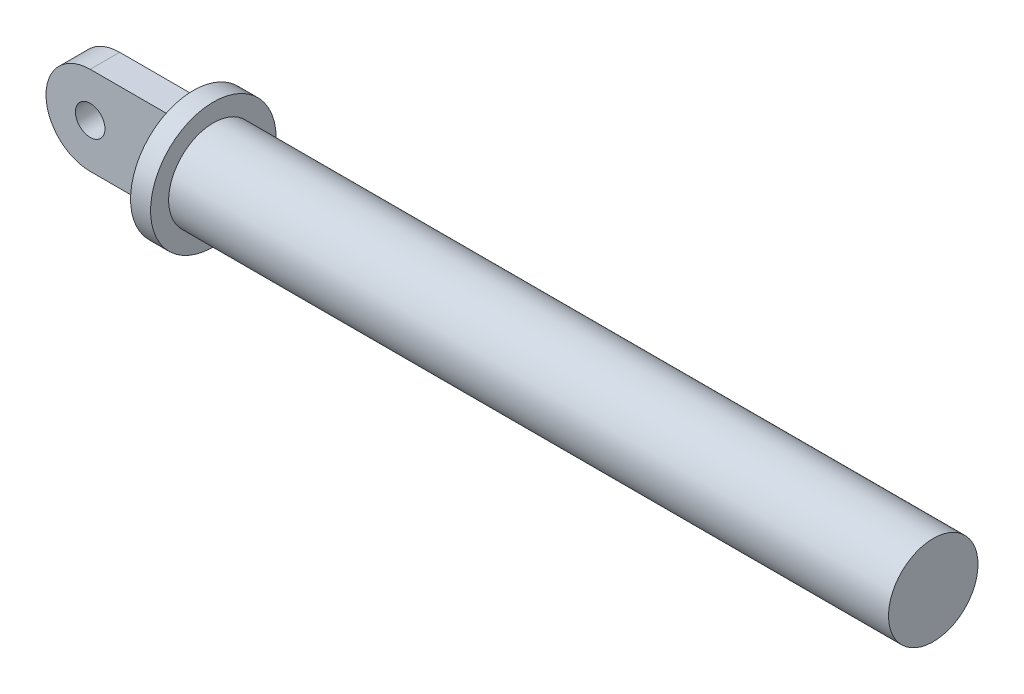
ISO-10303-21;
HEADER;
FILE_DESCRIPTION(('STEP AP214'),'2;1');
FILE_NAME('part.step','',(''),(''),'','','');
FILE_SCHEMA(('AUTOMOTIVE_DESIGN { 1 0 10303 214 1 1 1 1 }'));
ENDSEC;
DATA;
#1=APPLICATION_CONTEXT('core data for automotive mechanical design processes');
#2=APPLICATION_PROTOCOL_DEFINITION('international standard','automotive_design',2000,#1);
#3=PRODUCT_CONTEXT('',#1,'mechanical');
#4=PRODUCT('Part','Part','',(#3));
#5=PRODUCT_RELATED_PRODUCT_CATEGORY('part','',(#4));
#6=PRODUCT_DEFINITION_FORMATION('','',#4);
#7=PRODUCT_DEFINITION_CONTEXT('part definition',#1,'design');
#8=PRODUCT_DEFINITION('design','',#6,#7);
#9=PRODUCT_DEFINITION_SHAPE('','',#8);
#10=(LENGTH_UNIT() NAMED_UNIT(*) SI_UNIT(.MILLI.,.METRE.));
#11=(NAMED_UNIT(*) PLANE_ANGLE_UNIT() SI_UNIT($,.RADIAN.));
#12=(NAMED_UNIT(*) SI_UNIT($,.STERADIAN.) SOLID_ANGLE_UNIT());
#13=UNCERTAINTY_MEASURE_WITH_UNIT(LENGTH_MEASURE(1.E-05),#10,'distance_accuracy_value','');
#14=(GEOMETRIC_REPRESENTATION_CONTEXT(3) GLOBAL_UNCERTAINTY_ASSIGNED_CONTEXT((#13)) GLOBAL_UNIT_ASSIGNED_CONTEXT((#10,
#11,#12)) REPRESENTATION_CONTEXT('',''));
#15=CARTESIAN_POINT('',(0.,0.,0.));
#16=DIRECTION('',(0.,0.,1.));
#17=DIRECTION('',(1.,0.,0.));
#18=AXIS2_PLACEMENT_3D('',#15,#16,#17);
#19=CARTESIAN_POINT('',(-52.4189353722762,24.017679889152,5.));
#20=DIRECTION('',(0.,0.,1.));
#21=DIRECTION('',(1.,0.,0.));
#22=AXIS2_PLACEMENT_3D('',#19,#20,#21);
#23=PLANE('',#22);
#24=CARTESIAN_POINT('',(-52.4189353722762,24.017679889152,5.));
#25=DIRECTION('',(0.,0.,1.));
#26=DIRECTION('',(1.,0.,0.));
#27=AXIS2_PLACEMENT_3D('',#24,#25,#26);
#28=CIRCLE('',#27,15.);
#29=CARTESIAN_POINT('',(-52.4189353722762,39.017679889152,5.));
#30=VERTEX_POINT('',#29);
#31=CARTESIAN_POINT('',(-52.4189353722762,9.01767988915204,5.));
#32=VERTEX_POINT('',#31);
#33=EDGE_CURVE('E77',#30,#32,#28,.T.);
#34=ORIENTED_EDGE('',*,*,#33,.T.);
#35=DIRECTION('',(1.,0.,0.));
#36=VECTOR('',#35,1.);
#37=CARTESIAN_POINT('',(-52.4189353722762,9.01767988915204,5.));
#38=LINE('',#37,#36);
#39=CARTESIAN_POINT('',(-22.4189353722762,9.01767988915204,5.));
#40=VERTEX_POINT('',#39);
#41=EDGE_CURVE('E108',#32,#40,#38,.T.);
#42=ORIENTED_EDGE('',*,*,#41,.T.);
#43=DIRECTION('',(0.,1.,0.));
#44=VECTOR('',#43,1.);
#45=CARTESIAN_POINT('',(-22.4189353722762,39.017679889152,5.));
#46=LINE('',#45,#44);
#47=CARTESIAN_POINT('',(-22.4189353722762,39.017679889152,5.));
#48=VERTEX_POINT('',#47);
#49=EDGE_CURVE('E102',#40,#48,#46,.T.);
#50=ORIENTED_EDGE('',*,*,#49,.T.);
#51=DIRECTION('',(-1.,0.,0.));
#52=VECTOR('',#51,1.);
#53=CARTESIAN_POINT('',(-52.4189353722762,39.017679889152,5.));
#54=LINE('',#53,#52);
#55=EDGE_CURVE('E49',#48,#30,#54,.T.);
#56=ORIENTED_EDGE('',*,*,#55,.T.);
#57=EDGE_LOOP('',(#34,#42,#50,#56));
#58=FACE_BOUND('',#57,.T.);
#59=CARTESIAN_POINT('',(-52.4189353722762,24.017679889152,5.));
#60=DIRECTION('',(0.,0.,1.));
#61=DIRECTION('',(1.,0.,0.));
#62=AXIS2_PLACEMENT_3D('',#59,#60,#61);
#63=CIRCLE('',#62,5.00368331024003);
#64=CARTESIAN_POINT('',(-47.4152520620362,24.017679889152,5.));
#65=VERTEX_POINT('',#64);
#66=EDGE_CURVE('E88',#65,#65,#63,.T.);
#67=ORIENTED_EDGE('',*,*,#66,.F.);
#68=EDGE_LOOP('',(#67));
#69=FACE_BOUND('',#68,.T.);
#70=ADVANCED_FACE('F32',(#58,#69),#23,.T.);
#71=CARTESIAN_POINT('',(-52.4189353722762,24.017679889152,-5.));
#72=DIRECTION('',(0.,0.,1.));
#73=DIRECTION('',(1.,0.,0.));
#74=AXIS2_PLACEMENT_3D('',#71,#72,#73);
#75=PLANE('',#74);
#76=CARTESIAN_POINT('',(-52.4189353722762,24.017679889152,-5.));
#77=DIRECTION('',(0.,0.,1.));
#78=DIRECTION('',(1.,0.,0.));
#79=AXIS2_PLACEMENT_3D('',#76,#77,#78);
#80=CIRCLE('',#79,15.);
#81=CARTESIAN_POINT('',(-52.4189353722762,39.017679889152,-5.));
#82=VERTEX_POINT('',#81);
#83=CARTESIAN_POINT('',(-52.4189353722762,9.01767988915204,-5.));
#84=VERTEX_POINT('',#83);
#85=EDGE_CURVE('E82',#82,#84,#80,.T.);
#86=ORIENTED_EDGE('',*,*,#85,.F.);
#87=DIRECTION('',(-1.,0.,0.));
#88=VECTOR('',#87,1.);
#89=CARTESIAN_POINT('',(-52.4189353722762,39.017679889152,-5.));
#90=LINE('',#89,#88);
#91=CARTESIAN_POINT('',(-22.4189353722762,39.017679889152,-5.));
#92=VERTEX_POINT('',#91);
#93=EDGE_CURVE('E69',#92,#82,#90,.T.);
#94=ORIENTED_EDGE('',*,*,#93,.F.);
#95=DIRECTION('',(0.,1.,0.));
#96=VECTOR('',#95,1.);
#97=CARTESIAN_POINT('',(-22.4189353722762,39.017679889152,-5.));
#98=LINE('',#97,#96);
#99=CARTESIAN_POINT('',(-22.4189353722762,9.01767988915204,-5.));
#100=VERTEX_POINT('',#99);
#101=EDGE_CURVE('E64',#100,#92,#98,.T.);
#102=ORIENTED_EDGE('',*,*,#101,.F.);
#103=DIRECTION('',(1.,0.,0.));
#104=VECTOR('',#103,1.);
#105=CARTESIAN_POINT('',(-52.4189353722762,9.01767988915204,-5.));
#106=LINE('',#105,#104);
#107=EDGE_CURVE('E87',#84,#100,#106,.T.);
#108=ORIENTED_EDGE('',*,*,#107,.F.);
#109=EDGE_LOOP('',(#86,#94,#102,#108));
#110=FACE_BOUND('',#109,.T.);
#111=CARTESIAN_POINT('',(-52.4189353722762,24.017679889152,-5.));
#112=DIRECTION('',(0.,0.,1.));
#113=DIRECTION('',(1.,0.,0.));
#114=AXIS2_PLACEMENT_3D('',#111,#112,#113);
#115=CIRCLE('',#114,5.00368331024003);
#116=CARTESIAN_POINT('',(-47.4152520620362,24.017679889152,-5.));
#117=VERTEX_POINT('',#116);
#118=EDGE_CURVE('E92',#117,#117,#115,.T.);
#119=ORIENTED_EDGE('',*,*,#118,.T.);
#120=EDGE_LOOP('',(#119));
#121=FACE_BOUND('',#120,.T.);
#122=ADVANCED_FACE('F84',(#110,#121),#75,.F.);
#123=CARTESIAN_POINT('',(-52.4189353722762,24.017679889152,5.));
#124=DIRECTION('',(0.,0.,-1.));
#125=DIRECTION('',(-1.,0.,0.));
#126=AXIS2_PLACEMENT_3D('',#123,#124,#125);
#127=CYLINDRICAL_SURFACE('',#126,15.);
#128=ORIENTED_EDGE('',*,*,#85,.T.);
#129=DIRECTION('',(0.,0.,-1.));
#130=VECTOR('',#129,1.);
#131=CARTESIAN_POINT('',(-52.4189353722762,9.01767988915204,5.));
#132=LINE('',#131,#130);
#133=EDGE_CURVE('E11',#32,#84,#132,.T.);
#134=ORIENTED_EDGE('',*,*,#133,.F.);
#135=ORIENTED_EDGE('',*,*,#33,.F.);
#136=DIRECTION('',(0.,0.,-1.));
#137=VECTOR('',#136,1.);
#138=CARTESIAN_POINT('',(-52.4189353722762,39.017679889152,5.));
#139=LINE('',#138,#137);
#140=EDGE_CURVE('E72',#30,#82,#139,.T.);
#141=ORIENTED_EDGE('',*,*,#140,.T.);
#142=EDGE_LOOP('',(#128,#134,#135,#141));
#143=FACE_BOUND('',#142,.T.);
#144=ADVANCED_FACE('F34',(#143),#127,.T.);
#145=CARTESIAN_POINT('',(-52.4189353722762,9.01767988915204,5.));
#146=DIRECTION('',(0.,1.,0.));
#147=DIRECTION('',(0.,0.,1.));
#148=AXIS2_PLACEMENT_3D('',#145,#146,#147);
#149=PLANE('',#148);
#150=ORIENTED_EDGE('',*,*,#107,.T.);
#151=DIRECTION('',(0.,0.,-1.));
#152=VECTOR('',#151,1.);
#153=CARTESIAN_POINT('',(-22.4189353722762,9.01767988915204,5.));
#154=LINE('',#153,#152);
#155=EDGE_CURVE('E41',#40,#100,#154,.T.);
#156=ORIENTED_EDGE('',*,*,#155,.F.);
#157=ORIENTED_EDGE('',*,*,#41,.F.);
#158=ORIENTED_EDGE('',*,*,#133,.T.);
#159=EDGE_LOOP('',(#150,#156,#157,#158));
#160=FACE_BOUND('',#159,.T.);
#161=ADVANCED_FACE('F107',(#160),#149,.F.);
#162=CARTESIAN_POINT('',(-52.4189353722762,39.017679889152,5.));
#163=DIRECTION('',(0.,-1.,0.));
#164=DIRECTION('',(0.,0.,-1.));
#165=AXIS2_PLACEMENT_3D('',#162,#163,#164);
#166=PLANE('',#165);
#167=ORIENTED_EDGE('',*,*,#93,.T.);
#168=ORIENTED_EDGE('',*,*,#140,.F.);
#169=ORIENTED_EDGE('',*,*,#55,.F.);
#170=DIRECTION('',(0.,0.,-1.));
#171=VECTOR('',#170,1.);
#172=CARTESIAN_POINT('',(-22.4189353722762,39.017679889152,5.));
#173=LINE('',#172,#171);
#174=EDGE_CURVE('E74',#48,#92,#173,.T.);
#175=ORIENTED_EDGE('',*,*,#174,.T.);
#176=EDGE_LOOP('',(#167,#168,#169,#175));
#177=FACE_BOUND('',#176,.T.);
#178=ADVANCED_FACE('F71',(#177),#166,.F.);
#179=CARTESIAN_POINT('',(-52.4189353722762,24.017679889152,5.));
#180=DIRECTION('',(0.,0.,-1.));
#181=DIRECTION('',(-1.,0.,0.));
#182=AXIS2_PLACEMENT_3D('',#179,#180,#181);
#183=CYLINDRICAL_SURFACE('',#182,5.00368331024003);
#184=ORIENTED_EDGE('',*,*,#66,.T.);
#185=EDGE_LOOP('',(#184));
#186=FACE_BOUND('',#185,.T.);
#187=ORIENTED_EDGE('',*,*,#118,.F.);
#188=EDGE_LOOP('',(#187));
#189=FACE_BOUND('',#188,.T.);
#190=ADVANCED_FACE('F151',(#186,#189),#183,.F.);
#191=CARTESIAN_POINT('',(-22.4189353722762,24.017679889152,0.));
#192=DIRECTION('',(-1.,0.,0.));
#193=DIRECTION('',(0.,0.,1.));
#194=AXIS2_PLACEMENT_3D('',#191,#192,#193);
#195=PLANE('',#194);
#196=CARTESIAN_POINT('',(-22.4189353722762,24.017679889152,0.));
#197=DIRECTION('',(1.,0.,0.));
#198=DIRECTION('',(0.,0.,-1.));
#199=AXIS2_PLACEMENT_3D('',#196,#197,#198);
#200=CIRCLE('',#199,21.3065893785708);
#201=CARTESIAN_POINT('',(-22.4189353722762,24.017679889152,-21.3065893785708));
#202=VERTEX_POINT('',#201);
#203=EDGE_CURVE('E115',#202,#202,#200,.T.);
#204=ORIENTED_EDGE('',*,*,#203,.F.);
#205=EDGE_LOOP('',(#204));
#206=FACE_BOUND('',#205,.T.);
#207=ORIENTED_EDGE('',*,*,#155,.T.);
#208=ORIENTED_EDGE('',*,*,#101,.T.);
#209=ORIENTED_EDGE('',*,*,#174,.F.);
#210=ORIENTED_EDGE('',*,*,#49,.F.);
#211=EDGE_LOOP('',(#207,#208,#209,#210));
#212=FACE_BOUND('',#211,.T.);
#213=ADVANCED_FACE('F101',(#206,#212),#195,.T.);
#214=CARTESIAN_POINT('',(228.633930203511,24.017679889152,0.));
#215=DIRECTION('',(1.,0.,0.));
#216=DIRECTION('',(0.,0.,-1.));
#217=AXIS2_PLACEMENT_3D('',#214,#215,#216);
#218=CYLINDRICAL_SURFACE('',#217,21.3065893785708);
#219=ORIENTED_EDGE('',*,*,#203,.T.);
#220=EDGE_LOOP('',(#219));
#221=FACE_BOUND('',#220,.T.);
#222=CARTESIAN_POINT('',(-15.6234247403231,24.017679889152,0.));
#223=DIRECTION('',(1.,0.,0.));
#224=DIRECTION('',(0.,0.,-1.));
#225=AXIS2_PLACEMENT_3D('',#222,#223,#224);
#226=CIRCLE('',#225,21.3065893785708);
#227=CARTESIAN_POINT('',(-15.6234247403231,24.017679889152,-21.3065893785708));
#228=VERTEX_POINT('',#227);
#229=EDGE_CURVE('E119',#228,#228,#226,.T.);
#230=ORIENTED_EDGE('',*,*,#229,.F.);
#231=EDGE_LOOP('',(#230));
#232=FACE_BOUND('',#231,.T.);
#233=ADVANCED_FACE('F141',(#221,#232),#218,.T.);
#234=CARTESIAN_POINT('',(-15.6234247403231,45.3242692677229,0.));
#235=DIRECTION('',(1.,0.,0.));
#236=DIRECTION('',(0.,0.,-1.));
#237=AXIS2_PLACEMENT_3D('',#234,#235,#236);
#238=PLANE('',#237);
#239=ORIENTED_EDGE('',*,*,#229,.T.);
#240=EDGE_LOOP('',(#239));
#241=FACE_BOUND('',#240,.T.);
#242=CARTESIAN_POINT('',(-15.6234247403231,24.017679889152,0.));
#243=DIRECTION('',(1.,0.,0.));
#244=DIRECTION('',(0.,0.,-1.));
#245=AXIS2_PLACEMENT_3D('',#242,#243,#244);
#246=CIRCLE('',#245,15.1772236134379);
#247=CARTESIAN_POINT('',(-15.6234247403231,24.017679889152,-15.1772236134379));
#248=VERTEX_POINT('',#247);
#249=EDGE_CURVE('E122',#248,#248,#246,.T.);
#250=ORIENTED_EDGE('',*,*,#249,.F.);
#251=EDGE_LOOP('',(#250));
#252=FACE_BOUND('',#251,.T.);
#253=ADVANCED_FACE('F133',(#241,#252),#238,.T.);
#254=CARTESIAN_POINT('',(228.633930203511,24.017679889152,0.));
#255=DIRECTION('',(1.,0.,0.));
#256=DIRECTION('',(0.,0.,-1.));
#257=AXIS2_PLACEMENT_3D('',#254,#255,#256);
#258=CYLINDRICAL_SURFACE('',#257,15.1772236134379);
#259=ORIENTED_EDGE('',*,*,#249,.T.);
#260=EDGE_LOOP('',(#259));
#261=FACE_BOUND('',#260,.T.);
#262=CARTESIAN_POINT('',(228.633930203511,24.017679889152,0.));
#263=DIRECTION('',(1.,0.,0.));
#264=DIRECTION('',(0.,0.,-1.));
#265=AXIS2_PLACEMENT_3D('',#262,#263,#264);
#266=CIRCLE('',#265,15.1772236134379);
#267=CARTESIAN_POINT('',(228.633930203511,24.017679889152,-15.1772236134379));
#268=VERTEX_POINT('',#267);
#269=EDGE_CURVE('E125',#268,#268,#266,.T.);
#270=ORIENTED_EDGE('',*,*,#269,.F.);
#271=EDGE_LOOP('',(#270));
#272=FACE_BOUND('',#271,.T.);
#273=ADVANCED_FACE('F131',(#261,#272),#258,.T.);
#274=CARTESIAN_POINT('',(228.633930203511,39.1949035025899,0.));
#275=DIRECTION('',(1.,0.,0.));
#276=DIRECTION('',(0.,0.,-1.));
#277=AXIS2_PLACEMENT_3D('',#274,#275,#276);
#278=PLANE('',#277);
#279=ORIENTED_EDGE('',*,*,#269,.T.);
#280=EDGE_LOOP('',(#279));
#281=FACE_BOUND('',#280,.T.);
#282=ADVANCED_FACE('F129',(#281),#278,.T.);
#283=CLOSED_SHELL('',(#70,#122,#144,#161,#178,#190,#213,#233,#253,#273,#282));
#284=MANIFOLD_SOLID_BREP('B2',#283);
#285=ADVANCED_BREP_SHAPE_REPRESENTATION('',(#18,#284),#14);
#286=SHAPE_DEFINITION_REPRESENTATION(#9,#285);
ENDSEC;
END-ISO-10303-21;
